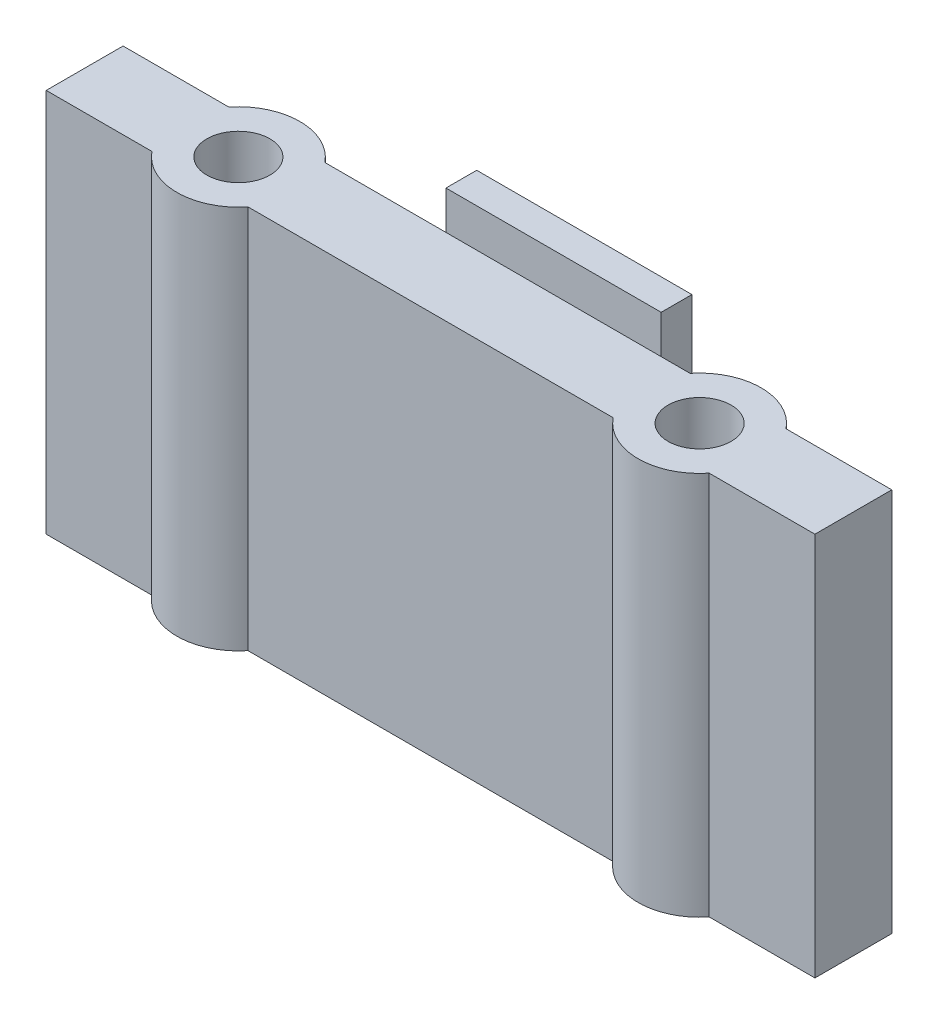
ISO-10303-21;
HEADER;
FILE_DESCRIPTION(('STEP AP214'),'2;1');
FILE_NAME('part.step','',(''),(''),'','','');
FILE_SCHEMA(('AUTOMOTIVE_DESIGN { 1 0 10303 214 1 1 1 1 }'));
ENDSEC;
DATA;
#1=APPLICATION_CONTEXT('core data for automotive mechanical design processes');
#2=APPLICATION_PROTOCOL_DEFINITION('international standard','automotive_design',2000,#1);
#3=PRODUCT_CONTEXT('',#1,'mechanical');
#4=PRODUCT('Part','Part','',(#3));
#5=PRODUCT_RELATED_PRODUCT_CATEGORY('part','',(#4));
#6=PRODUCT_DEFINITION_FORMATION('','',#4);
#7=PRODUCT_DEFINITION_CONTEXT('part definition',#1,'design');
#8=PRODUCT_DEFINITION('design','',#6,#7);
#9=PRODUCT_DEFINITION_SHAPE('','',#8);
#10=(LENGTH_UNIT() NAMED_UNIT(*) SI_UNIT(.MILLI.,.METRE.));
#11=(NAMED_UNIT(*) PLANE_ANGLE_UNIT() SI_UNIT($,.RADIAN.));
#12=(NAMED_UNIT(*) SI_UNIT($,.STERADIAN.) SOLID_ANGLE_UNIT());
#13=UNCERTAINTY_MEASURE_WITH_UNIT(LENGTH_MEASURE(1.E-05),#10,'distance_accuracy_value','');
#14=(GEOMETRIC_REPRESENTATION_CONTEXT(3) GLOBAL_UNCERTAINTY_ASSIGNED_CONTEXT((#13)) GLOBAL_UNIT_ASSIGNED_CONTEXT((#10,
#11,#12)) REPRESENTATION_CONTEXT('',''));
#15=CARTESIAN_POINT('',(0.,0.,0.));
#16=DIRECTION('',(0.,0.,1.));
#17=DIRECTION('',(1.,0.,0.));
#18=AXIS2_PLACEMENT_3D('',#15,#16,#17);
#19=CARTESIAN_POINT('',(7.,20.5,-7.5));
#20=DIRECTION('',(0.,-1.,0.));
#21=DIRECTION('',(0.,0.,-1.));
#22=AXIS2_PLACEMENT_3D('',#19,#20,#21);
#23=PLANE('',#22);
#24=DIRECTION('',(1.,0.,0.));
#25=VECTOR('',#24,1.);
#26=CARTESIAN_POINT('',(7.,20.5,-5.5));
#27=LINE('',#26,#25);
#28=CARTESIAN_POINT('',(-7.00000000000001,20.5,-5.5));
#29=VERTEX_POINT('',#28);
#30=CARTESIAN_POINT('',(7.,20.5,-5.5));
#31=VERTEX_POINT('',#30);
#32=EDGE_CURVE('E358',#29,#31,#27,.T.);
#33=ORIENTED_EDGE('',*,*,#32,.F.);
#34=DIRECTION('',(0.,0.,1.));
#35=VECTOR('',#34,1.);
#36=CARTESIAN_POINT('',(-7.00000000000001,20.5,-7.5));
#37=LINE('',#36,#35);
#38=CARTESIAN_POINT('',(-7.00000000000001,20.5,-2.5));
#39=VERTEX_POINT('',#38);
#40=EDGE_CURVE('E55',#29,#39,#37,.T.);
#41=ORIENTED_EDGE('',*,*,#40,.T.);
#42=DIRECTION('',(1.,0.,0.));
#43=VECTOR('',#42,1.);
#44=CARTESIAN_POINT('',(7.,20.5,-2.5));
#45=LINE('',#44,#43);
#46=CARTESIAN_POINT('',(7.,20.5,-2.5));
#47=VERTEX_POINT('',#46);
#48=EDGE_CURVE('E327',#39,#47,#45,.T.);
#49=ORIENTED_EDGE('',*,*,#48,.T.);
#50=DIRECTION('',(0.,0.,1.));
#51=VECTOR('',#50,1.);
#52=CARTESIAN_POINT('',(7.,20.5,-7.5));
#53=LINE('',#52,#51);
#54=EDGE_CURVE('E322',#31,#47,#53,.T.);
#55=ORIENTED_EDGE('',*,*,#54,.F.);
#56=EDGE_LOOP('',(#33,#41,#49,#55));
#57=FACE_BOUND('',#56,.T.);
#58=ADVANCED_FACE('F39',(#57),#23,.F.);
#59=CARTESIAN_POINT('',(-11.8775010008008,25.,-2.5));
#60=DIRECTION('',(0.,0.,1.));
#61=DIRECTION('',(1.,0.,0.));
#62=AXIS2_PLACEMENT_3D('',#59,#60,#61);
#63=PLANE('',#62);
#64=ORIENTED_EDGE('',*,*,#48,.F.);
#65=DIRECTION('',(0.,1.,0.));
#66=VECTOR('',#65,1.);
#67=CARTESIAN_POINT('',(-7.00000000000001,20.5,-2.5));
#68=LINE('',#67,#66);
#69=CARTESIAN_POINT('',(-7.00000000000001,13.5,-2.5));
#70=VERTEX_POINT('',#69);
#71=EDGE_CURVE('E331',#70,#39,#68,.T.);
#72=ORIENTED_EDGE('',*,*,#71,.F.);
#73=DIRECTION('',(1.,0.,0.));
#74=VECTOR('',#73,1.);
#75=CARTESIAN_POINT('',(-11.8775010008008,13.5,-2.5));
#76=LINE('',#75,#74);
#77=CARTESIAN_POINT('',(6.99999999999999,13.5,-2.5));
#78=VERTEX_POINT('',#77);
#79=EDGE_CURVE('E363',#70,#78,#76,.T.);
#80=ORIENTED_EDGE('',*,*,#79,.T.);
#81=DIRECTION('',(0.,-1.,0.));
#82=VECTOR('',#81,1.);
#83=CARTESIAN_POINT('',(7.,20.5,-2.5));
#84=LINE('',#83,#82);
#85=EDGE_CURVE('E335',#47,#78,#84,.T.);
#86=ORIENTED_EDGE('',*,*,#85,.F.);
#87=EDGE_LOOP('',(#64,#72,#80,#86));
#88=FACE_BOUND('',#87,.T.);
#89=DIRECTION('',(0.,-1.,0.));
#90=VECTOR('',#89,1.);
#91=CARTESIAN_POINT('',(-11.8775010008008,25.,-2.5));
#92=LINE('',#91,#90);
#93=CARTESIAN_POINT('',(-11.8775010008008,25.,-2.5));
#94=VERTEX_POINT('',#93);
#95=CARTESIAN_POINT('',(-11.8775010008008,0.,-2.5));
#96=VERTEX_POINT('',#95);
#97=EDGE_CURVE('E233',#94,#96,#92,.T.);
#98=ORIENTED_EDGE('',*,*,#97,.F.);
#99=DIRECTION('',(-1.,0.,0.));
#100=VECTOR('',#99,1.);
#101=CARTESIAN_POINT('',(-11.8775010008008,25.,-2.5));
#102=LINE('',#101,#100);
#103=CARTESIAN_POINT('',(11.8775010008008,25.,-2.5));
#104=VERTEX_POINT('',#103);
#105=EDGE_CURVE('E267',#104,#94,#102,.T.);
#106=ORIENTED_EDGE('',*,*,#105,.F.);
#107=DIRECTION('',(0.,-1.,0.));
#108=VECTOR('',#107,1.);
#109=CARTESIAN_POINT('',(11.8775010008008,25.,-2.5));
#110=LINE('',#109,#108);
#111=CARTESIAN_POINT('',(11.8775010008008,0.,-2.5));
#112=VERTEX_POINT('',#111);
#113=EDGE_CURVE('E237',#104,#112,#110,.T.);
#114=ORIENTED_EDGE('',*,*,#113,.T.);
#115=DIRECTION('',(-1.,0.,0.));
#116=VECTOR('',#115,1.);
#117=CARTESIAN_POINT('',(-11.8775010008008,0.,-2.5));
#118=LINE('',#117,#116);
#119=EDGE_CURVE('E192',#112,#96,#118,.T.);
#120=ORIENTED_EDGE('',*,*,#119,.T.);
#121=EDGE_LOOP('',(#98,#106,#114,#120));
#122=FACE_BOUND('',#121,.T.);
#123=ADVANCED_FACE('F266',(#88,#122),#63,.F.);
#124=CARTESIAN_POINT('',(15.,25.,0.));
#125=DIRECTION('',(0.,1.,0.));
#126=DIRECTION('',(0.,0.,1.));
#127=AXIS2_PLACEMENT_3D('',#124,#125,#126);
#128=PLANE('',#127);
#129=DIRECTION('',(1.,0.,0.));
#130=VECTOR('',#129,1.);
#131=CARTESIAN_POINT('',(-11.8775010008008,25.,2.5));
#132=LINE('',#131,#130);
#133=CARTESIAN_POINT('',(-11.8775010008008,25.,2.5));
#134=VERTEX_POINT('',#133);
#135=CARTESIAN_POINT('',(11.8775010008008,25.,2.5));
#136=VERTEX_POINT('',#135);
#137=EDGE_CURVE('E150',#134,#136,#132,.T.);
#138=ORIENTED_EDGE('',*,*,#137,.T.);
#139=CARTESIAN_POINT('',(15.,25.,0.));
#140=DIRECTION('',(0.,1.,0.));
#141=DIRECTION('',(0.,0.,1.));
#142=AXIS2_PLACEMENT_3D('',#139,#140,#141);
#143=CIRCLE('',#142,4.);
#144=CARTESIAN_POINT('',(18.1224989991992,25.,2.5));
#145=VERTEX_POINT('',#144);
#146=EDGE_CURVE('E64',#136,#145,#143,.T.);
#147=ORIENTED_EDGE('',*,*,#146,.T.);
#148=DIRECTION('',(1.,0.,0.));
#149=VECTOR('',#148,1.);
#150=CARTESIAN_POINT('',(18.1224989991992,25.,2.5));
#151=LINE('',#150,#149);
#152=CARTESIAN_POINT('',(25.,25.,2.5));
#153=VERTEX_POINT('',#152);
#154=EDGE_CURVE('E214',#145,#153,#151,.T.);
#155=ORIENTED_EDGE('',*,*,#154,.T.);
#156=DIRECTION('',(0.,0.,-1.));
#157=VECTOR('',#156,1.);
#158=CARTESIAN_POINT('',(25.,25.,-2.5));
#159=LINE('',#158,#157);
#160=CARTESIAN_POINT('',(25.,25.,-2.5));
#161=VERTEX_POINT('',#160);
#162=EDGE_CURVE('E117',#153,#161,#159,.T.);
#163=ORIENTED_EDGE('',*,*,#162,.T.);
#164=DIRECTION('',(-1.,0.,0.));
#165=VECTOR('',#164,1.);
#166=CARTESIAN_POINT('',(18.1224989991992,25.,-2.5));
#167=LINE('',#166,#165);
#168=CARTESIAN_POINT('',(18.1224989991992,25.,-2.5));
#169=VERTEX_POINT('',#168);
#170=EDGE_CURVE('E251',#161,#169,#167,.T.);
#171=ORIENTED_EDGE('',*,*,#170,.T.);
#172=CARTESIAN_POINT('',(15.,25.,0.));
#173=DIRECTION('',(0.,1.,0.));
#174=DIRECTION('',(0.,0.,1.));
#175=AXIS2_PLACEMENT_3D('',#172,#173,#174);
#176=CIRCLE('',#175,4.);
#177=EDGE_CURVE('E271',#169,#104,#176,.T.);
#178=ORIENTED_EDGE('',*,*,#177,.T.);
#179=ORIENTED_EDGE('',*,*,#105,.T.);
#180=CARTESIAN_POINT('',(-15.,25.,0.));
#181=DIRECTION('',(0.,1.,0.));
#182=DIRECTION('',(0.,0.,1.));
#183=AXIS2_PLACEMENT_3D('',#180,#181,#182);
#184=CIRCLE('',#183,4.);
#185=CARTESIAN_POINT('',(-18.1224989991992,25.,-2.5));
#186=VERTEX_POINT('',#185);
#187=EDGE_CURVE('E270',#94,#186,#184,.T.);
#188=ORIENTED_EDGE('',*,*,#187,.T.);
#189=DIRECTION('',(-1.,0.,0.));
#190=VECTOR('',#189,1.);
#191=CARTESIAN_POINT('',(-25.,25.,-2.5));
#192=LINE('',#191,#190);
#193=CARTESIAN_POINT('',(-25.,25.,-2.5));
#194=VERTEX_POINT('',#193);
#195=EDGE_CURVE('E275',#186,#194,#192,.T.);
#196=ORIENTED_EDGE('',*,*,#195,.T.);
#197=DIRECTION('',(0.,0.,1.));
#198=VECTOR('',#197,1.);
#199=CARTESIAN_POINT('',(-25.,25.,-2.5));
#200=LINE('',#199,#198);
#201=CARTESIAN_POINT('',(-25.,25.,2.5));
#202=VERTEX_POINT('',#201);
#203=EDGE_CURVE('E282',#194,#202,#200,.T.);
#204=ORIENTED_EDGE('',*,*,#203,.T.);
#205=DIRECTION('',(1.,0.,0.));
#206=VECTOR('',#205,1.);
#207=CARTESIAN_POINT('',(-25.,25.,2.5));
#208=LINE('',#207,#206);
#209=CARTESIAN_POINT('',(-18.1224989991992,25.,2.5));
#210=VERTEX_POINT('',#209);
#211=EDGE_CURVE('E153',#202,#210,#208,.T.);
#212=ORIENTED_EDGE('',*,*,#211,.T.);
#213=CARTESIAN_POINT('',(-15.,25.,0.));
#214=DIRECTION('',(0.,1.,0.));
#215=DIRECTION('',(0.,0.,1.));
#216=AXIS2_PLACEMENT_3D('',#213,#214,#215);
#217=CIRCLE('',#216,4.);
#218=EDGE_CURVE('E145',#210,#134,#217,.T.);
#219=ORIENTED_EDGE('',*,*,#218,.T.);
#220=EDGE_LOOP('',(#138,#147,#155,#163,#171,#178,#179,#188,#196,#204,#212,#219));
#221=FACE_BOUND('',#220,.T.);
#222=CARTESIAN_POINT('',(-15.,25.,0.));
#223=DIRECTION('',(0.,1.,0.));
#224=DIRECTION('',(0.,0.,1.));
#225=AXIS2_PLACEMENT_3D('',#222,#223,#224);
#226=CIRCLE('',#225,2.05);
#227=CARTESIAN_POINT('',(-15.,25.,2.05));
#228=VERTEX_POINT('',#227);
#229=EDGE_CURVE('E183',#228,#228,#226,.T.);
#230=ORIENTED_EDGE('',*,*,#229,.F.);
#231=EDGE_LOOP('',(#230));
#232=FACE_BOUND('',#231,.T.);
#233=CARTESIAN_POINT('',(15.,25.,0.));
#234=DIRECTION('',(0.,1.,0.));
#235=DIRECTION('',(0.,0.,1.));
#236=AXIS2_PLACEMENT_3D('',#233,#234,#235);
#237=CIRCLE('',#236,2.05);
#238=CARTESIAN_POINT('',(15.,25.,2.05));
#239=VERTEX_POINT('',#238);
#240=EDGE_CURVE('E309',#239,#239,#237,.T.);
#241=ORIENTED_EDGE('',*,*,#240,.F.);
#242=EDGE_LOOP('',(#241));
#243=FACE_BOUND('',#242,.T.);
#244=ADVANCED_FACE('F147',(#221,#232,#243),#128,.T.);
#245=CARTESIAN_POINT('',(15.,0.,0.));
#246=DIRECTION('',(0.,1.,0.));
#247=DIRECTION('',(0.,0.,1.));
#248=AXIS2_PLACEMENT_3D('',#245,#246,#247);
#249=PLANE('',#248);
#250=DIRECTION('',(1.,0.,0.));
#251=VECTOR('',#250,1.);
#252=CARTESIAN_POINT('',(18.1224989991992,0.,2.5));
#253=LINE('',#252,#251);
#254=CARTESIAN_POINT('',(18.1224989991992,0.,2.5));
#255=VERTEX_POINT('',#254);
#256=CARTESIAN_POINT('',(25.,0.,2.5));
#257=VERTEX_POINT('',#256);
#258=EDGE_CURVE('E178',#255,#257,#253,.T.);
#259=ORIENTED_EDGE('',*,*,#258,.F.);
#260=CARTESIAN_POINT('',(15.,0.,0.));
#261=DIRECTION('',(0.,1.,0.));
#262=DIRECTION('',(0.,0.,1.));
#263=AXIS2_PLACEMENT_3D('',#260,#261,#262);
#264=CIRCLE('',#263,4.);
#265=CARTESIAN_POINT('',(11.8775010008008,0.,2.5));
#266=VERTEX_POINT('',#265);
#267=EDGE_CURVE('E109',#266,#255,#264,.T.);
#268=ORIENTED_EDGE('',*,*,#267,.F.);
#269=DIRECTION('',(1.,0.,0.));
#270=VECTOR('',#269,1.);
#271=CARTESIAN_POINT('',(-11.8775010008008,0.,2.5));
#272=LINE('',#271,#270);
#273=CARTESIAN_POINT('',(-11.8775010008008,0.,2.5));
#274=VERTEX_POINT('',#273);
#275=EDGE_CURVE('E209',#274,#266,#272,.T.);
#276=ORIENTED_EDGE('',*,*,#275,.F.);
#277=CARTESIAN_POINT('',(-15.,0.,0.));
#278=DIRECTION('',(0.,1.,0.));
#279=DIRECTION('',(0.,0.,1.));
#280=AXIS2_PLACEMENT_3D('',#277,#278,#279);
#281=CIRCLE('',#280,4.);
#282=CARTESIAN_POINT('',(-18.1224989991992,0.,2.5));
#283=VERTEX_POINT('',#282);
#284=EDGE_CURVE('E163',#283,#274,#281,.T.);
#285=ORIENTED_EDGE('',*,*,#284,.F.);
#286=DIRECTION('',(1.,0.,0.));
#287=VECTOR('',#286,1.);
#288=CARTESIAN_POINT('',(-25.,0.,2.5));
#289=LINE('',#288,#287);
#290=CARTESIAN_POINT('',(-25.,0.,2.5));
#291=VERTEX_POINT('',#290);
#292=EDGE_CURVE('E204',#291,#283,#289,.T.);
#293=ORIENTED_EDGE('',*,*,#292,.F.);
#294=DIRECTION('',(0.,0.,1.));
#295=VECTOR('',#294,1.);
#296=CARTESIAN_POINT('',(-25.,0.,-2.5));
#297=LINE('',#296,#295);
#298=CARTESIAN_POINT('',(-25.,0.,-2.5));
#299=VERTEX_POINT('',#298);
#300=EDGE_CURVE('E201',#299,#291,#297,.T.);
#301=ORIENTED_EDGE('',*,*,#300,.F.);
#302=DIRECTION('',(-1.,0.,0.));
#303=VECTOR('',#302,1.);
#304=CARTESIAN_POINT('',(-25.,0.,-2.5));
#305=LINE('',#304,#303);
#306=CARTESIAN_POINT('',(-18.1224989991992,0.,-2.5));
#307=VERTEX_POINT('',#306);
#308=EDGE_CURVE('E198',#307,#299,#305,.T.);
#309=ORIENTED_EDGE('',*,*,#308,.F.);
#310=CARTESIAN_POINT('',(-15.,0.,0.));
#311=DIRECTION('',(0.,1.,0.));
#312=DIRECTION('',(0.,0.,1.));
#313=AXIS2_PLACEMENT_3D('',#310,#311,#312);
#314=CIRCLE('',#313,4.);
#315=EDGE_CURVE('E195',#96,#307,#314,.T.);
#316=ORIENTED_EDGE('',*,*,#315,.F.);
#317=ORIENTED_EDGE('',*,*,#119,.F.);
#318=CARTESIAN_POINT('',(15.,0.,0.));
#319=DIRECTION('',(0.,1.,0.));
#320=DIRECTION('',(0.,0.,1.));
#321=AXIS2_PLACEMENT_3D('',#318,#319,#320);
#322=CIRCLE('',#321,4.);
#323=CARTESIAN_POINT('',(18.1224989991992,0.,-2.5));
#324=VERTEX_POINT('',#323);
#325=EDGE_CURVE('E189',#324,#112,#322,.T.);
#326=ORIENTED_EDGE('',*,*,#325,.F.);
#327=DIRECTION('',(-1.,0.,0.));
#328=VECTOR('',#327,1.);
#329=CARTESIAN_POINT('',(18.1224989991992,0.,-2.5));
#330=LINE('',#329,#328);
#331=CARTESIAN_POINT('',(25.,0.,-2.5));
#332=VERTEX_POINT('',#331);
#333=EDGE_CURVE('E186',#332,#324,#330,.T.);
#334=ORIENTED_EDGE('',*,*,#333,.F.);
#335=DIRECTION('',(0.,0.,-1.));
#336=VECTOR('',#335,1.);
#337=CARTESIAN_POINT('',(25.,0.,-2.5));
#338=LINE('',#337,#336);
#339=EDGE_CURVE('E182',#257,#332,#338,.T.);
#340=ORIENTED_EDGE('',*,*,#339,.F.);
#341=EDGE_LOOP('',(#259,#268,#276,#285,#293,#301,#309,#316,#317,#326,#334,#340));
#342=FACE_BOUND('',#341,.T.);
#343=CARTESIAN_POINT('',(-15.,0.,0.));
#344=DIRECTION('',(0.,1.,0.));
#345=DIRECTION('',(0.,0.,1.));
#346=AXIS2_PLACEMENT_3D('',#343,#344,#345);
#347=CIRCLE('',#346,2.05);
#348=CARTESIAN_POINT('',(-15.,0.,2.05));
#349=VERTEX_POINT('',#348);
#350=EDGE_CURVE('E304',#349,#349,#347,.T.);
#351=ORIENTED_EDGE('',*,*,#350,.T.);
#352=EDGE_LOOP('',(#351));
#353=FACE_BOUND('',#352,.T.);
#354=CARTESIAN_POINT('',(15.,0.,0.));
#355=DIRECTION('',(0.,1.,0.));
#356=DIRECTION('',(0.,0.,1.));
#357=AXIS2_PLACEMENT_3D('',#354,#355,#356);
#358=CIRCLE('',#357,2.05);
#359=CARTESIAN_POINT('',(15.,0.,2.05));
#360=VERTEX_POINT('',#359);
#361=EDGE_CURVE('E313',#360,#360,#358,.T.);
#362=ORIENTED_EDGE('',*,*,#361,.T.);
#363=EDGE_LOOP('',(#362));
#364=FACE_BOUND('',#363,.T.);
#365=ADVANCED_FACE('F255',(#342,#353,#364),#249,.F.);
#366=CARTESIAN_POINT('',(18.1224989991992,25.,2.5));
#367=DIRECTION('',(0.,0.,-1.));
#368=DIRECTION('',(-1.,0.,0.));
#369=AXIS2_PLACEMENT_3D('',#366,#367,#368);
#370=PLANE('',#369);
#371=ORIENTED_EDGE('',*,*,#258,.T.);
#372=DIRECTION('',(0.,-1.,0.));
#373=VECTOR('',#372,1.);
#374=CARTESIAN_POINT('',(25.,25.,2.5));
#375=LINE('',#374,#373);
#376=EDGE_CURVE('E11',#153,#257,#375,.T.);
#377=ORIENTED_EDGE('',*,*,#376,.F.);
#378=ORIENTED_EDGE('',*,*,#154,.F.);
#379=DIRECTION('',(0.,-1.,0.));
#380=VECTOR('',#379,1.);
#381=CARTESIAN_POINT('',(18.1224989991992,25.,2.5));
#382=LINE('',#381,#380);
#383=EDGE_CURVE('E174',#145,#255,#382,.T.);
#384=ORIENTED_EDGE('',*,*,#383,.T.);
#385=EDGE_LOOP('',(#371,#377,#378,#384));
#386=FACE_BOUND('',#385,.T.);
#387=ADVANCED_FACE('F41',(#386),#370,.F.);
#388=CARTESIAN_POINT('',(25.,25.,-2.5));
#389=DIRECTION('',(-1.,0.,0.));
#390=DIRECTION('',(0.,0.,1.));
#391=AXIS2_PLACEMENT_3D('',#388,#389,#390);
#392=PLANE('',#391);
#393=ORIENTED_EDGE('',*,*,#339,.T.);
#394=DIRECTION('',(0.,-1.,0.));
#395=VECTOR('',#394,1.);
#396=CARTESIAN_POINT('',(25.,25.,-2.5));
#397=LINE('',#396,#395);
#398=EDGE_CURVE('E48',#161,#332,#397,.T.);
#399=ORIENTED_EDGE('',*,*,#398,.F.);
#400=ORIENTED_EDGE('',*,*,#162,.F.);
#401=ORIENTED_EDGE('',*,*,#376,.T.);
#402=EDGE_LOOP('',(#393,#399,#400,#401));
#403=FACE_BOUND('',#402,.T.);
#404=ADVANCED_FACE('F448',(#403),#392,.F.);
#405=CARTESIAN_POINT('',(18.1224989991992,25.,-2.5));
#406=DIRECTION('',(0.,0.,1.));
#407=DIRECTION('',(1.,0.,0.));
#408=AXIS2_PLACEMENT_3D('',#405,#406,#407);
#409=PLANE('',#408);
#410=ORIENTED_EDGE('',*,*,#333,.T.);
#411=DIRECTION('',(0.,-1.,0.));
#412=VECTOR('',#411,1.);
#413=CARTESIAN_POINT('',(18.1224989991992,25.,-2.5));
#414=LINE('',#413,#412);
#415=EDGE_CURVE('E241',#169,#324,#414,.T.);
#416=ORIENTED_EDGE('',*,*,#415,.F.);
#417=ORIENTED_EDGE('',*,*,#170,.F.);
#418=ORIENTED_EDGE('',*,*,#398,.T.);
#419=EDGE_LOOP('',(#410,#416,#417,#418));
#420=FACE_BOUND('',#419,.T.);
#421=ADVANCED_FACE('F249',(#420),#409,.F.);
#422=CARTESIAN_POINT('',(15.,25.,0.));
#423=DIRECTION('',(0.,-1.,0.));
#424=DIRECTION('',(0.,0.,-1.));
#425=AXIS2_PLACEMENT_3D('',#422,#423,#424);
#426=CYLINDRICAL_SURFACE('',#425,4.);
#427=ORIENTED_EDGE('',*,*,#325,.T.);
#428=ORIENTED_EDGE('',*,*,#113,.F.);
#429=ORIENTED_EDGE('',*,*,#177,.F.);
#430=ORIENTED_EDGE('',*,*,#415,.T.);
#431=EDGE_LOOP('',(#427,#428,#429,#430));
#432=FACE_BOUND('',#431,.T.);
#433=ADVANCED_FACE('F261',(#432),#426,.T.);
#434=CARTESIAN_POINT('',(-15.,25.,0.));
#435=DIRECTION('',(0.,-1.,0.));
#436=DIRECTION('',(0.,0.,-1.));
#437=AXIS2_PLACEMENT_3D('',#434,#435,#436);
#438=CYLINDRICAL_SURFACE('',#437,4.);
#439=ORIENTED_EDGE('',*,*,#315,.T.);
#440=DIRECTION('',(0.,-1.,0.));
#441=VECTOR('',#440,1.);
#442=CARTESIAN_POINT('',(-18.1224989991992,25.,-2.5));
#443=LINE('',#442,#441);
#444=EDGE_CURVE('E229',#186,#307,#443,.T.);
#445=ORIENTED_EDGE('',*,*,#444,.F.);
#446=ORIENTED_EDGE('',*,*,#187,.F.);
#447=ORIENTED_EDGE('',*,*,#97,.T.);
#448=EDGE_LOOP('',(#439,#445,#446,#447));
#449=FACE_BOUND('',#448,.T.);
#450=ADVANCED_FACE('F443',(#449),#438,.T.);
#451=CARTESIAN_POINT('',(-25.,25.,-2.5));
#452=DIRECTION('',(0.,0.,1.));
#453=DIRECTION('',(1.,0.,0.));
#454=AXIS2_PLACEMENT_3D('',#451,#452,#453);
#455=PLANE('',#454);
#456=ORIENTED_EDGE('',*,*,#308,.T.);
#457=DIRECTION('',(0.,-1.,0.));
#458=VECTOR('',#457,1.);
#459=CARTESIAN_POINT('',(-25.,25.,-2.5));
#460=LINE('',#459,#458);
#461=EDGE_CURVE('E225',#194,#299,#460,.T.);
#462=ORIENTED_EDGE('',*,*,#461,.F.);
#463=ORIENTED_EDGE('',*,*,#195,.F.);
#464=ORIENTED_EDGE('',*,*,#444,.T.);
#465=EDGE_LOOP('',(#456,#462,#463,#464));
#466=FACE_BOUND('',#465,.T.);
#467=ADVANCED_FACE('F472',(#466),#455,.F.);
#468=CARTESIAN_POINT('',(-25.,25.,-2.5));
#469=DIRECTION('',(1.,0.,0.));
#470=DIRECTION('',(0.,0.,-1.));
#471=AXIS2_PLACEMENT_3D('',#468,#469,#470);
#472=PLANE('',#471);
#473=ORIENTED_EDGE('',*,*,#300,.T.);
#474=DIRECTION('',(0.,-1.,0.));
#475=VECTOR('',#474,1.);
#476=CARTESIAN_POINT('',(-25.,25.,2.5));
#477=LINE('',#476,#475);
#478=EDGE_CURVE('E221',#202,#291,#477,.T.);
#479=ORIENTED_EDGE('',*,*,#478,.F.);
#480=ORIENTED_EDGE('',*,*,#203,.F.);
#481=ORIENTED_EDGE('',*,*,#461,.T.);
#482=EDGE_LOOP('',(#473,#479,#480,#481));
#483=FACE_BOUND('',#482,.T.);
#484=ADVANCED_FACE('F290',(#483),#472,.F.);
#485=CARTESIAN_POINT('',(-25.,25.,2.5));
#486=DIRECTION('',(0.,0.,-1.));
#487=DIRECTION('',(-1.,0.,0.));
#488=AXIS2_PLACEMENT_3D('',#485,#486,#487);
#489=PLANE('',#488);
#490=ORIENTED_EDGE('',*,*,#292,.T.);
#491=DIRECTION('',(0.,-1.,0.));
#492=VECTOR('',#491,1.);
#493=CARTESIAN_POINT('',(-18.1224989991992,25.,2.5));
#494=LINE('',#493,#492);
#495=EDGE_CURVE('E167',#210,#283,#494,.T.);
#496=ORIENTED_EDGE('',*,*,#495,.F.);
#497=ORIENTED_EDGE('',*,*,#211,.F.);
#498=ORIENTED_EDGE('',*,*,#478,.T.);
#499=EDGE_LOOP('',(#490,#496,#497,#498));
#500=FACE_BOUND('',#499,.T.);
#501=ADVANCED_FACE('F294',(#500),#489,.F.);
#502=CARTESIAN_POINT('',(-15.,25.,0.));
#503=DIRECTION('',(0.,-1.,0.));
#504=DIRECTION('',(0.,0.,-1.));
#505=AXIS2_PLACEMENT_3D('',#502,#503,#504);
#506=CYLINDRICAL_SURFACE('',#505,4.);
#507=ORIENTED_EDGE('',*,*,#284,.T.);
#508=DIRECTION('',(0.,-1.,0.));
#509=VECTOR('',#508,1.);
#510=CARTESIAN_POINT('',(-11.8775010008008,25.,2.5));
#511=LINE('',#510,#509);
#512=EDGE_CURVE('E160',#134,#274,#511,.T.);
#513=ORIENTED_EDGE('',*,*,#512,.F.);
#514=ORIENTED_EDGE('',*,*,#218,.F.);
#515=ORIENTED_EDGE('',*,*,#495,.T.);
#516=EDGE_LOOP('',(#507,#513,#514,#515));
#517=FACE_BOUND('',#516,.T.);
#518=ADVANCED_FACE('F161',(#517),#506,.T.);
#519=CARTESIAN_POINT('',(-11.8775010008008,25.,2.5));
#520=DIRECTION('',(0.,0.,-1.));
#521=DIRECTION('',(-1.,0.,0.));
#522=AXIS2_PLACEMENT_3D('',#519,#520,#521);
#523=PLANE('',#522);
#524=DIRECTION('',(0.,-1.,0.));
#525=VECTOR('',#524,1.);
#526=CARTESIAN_POINT('',(11.8775010008008,25.,2.5));
#527=LINE('',#526,#525);
#528=EDGE_CURVE('E168',#136,#266,#527,.T.);
#529=ORIENTED_EDGE('',*,*,#528,.F.);
#530=ORIENTED_EDGE('',*,*,#137,.F.);
#531=ORIENTED_EDGE('',*,*,#512,.T.);
#532=ORIENTED_EDGE('',*,*,#275,.T.);
#533=EDGE_LOOP('',(#529,#530,#531,#532));
#534=FACE_BOUND('',#533,.T.);
#535=ADVANCED_FACE('F170',(#534),#523,.F.);
#536=CARTESIAN_POINT('',(15.,25.,0.));
#537=DIRECTION('',(0.,-1.,0.));
#538=DIRECTION('',(0.,0.,-1.));
#539=AXIS2_PLACEMENT_3D('',#536,#537,#538);
#540=CYLINDRICAL_SURFACE('',#539,4.);
#541=ORIENTED_EDGE('',*,*,#267,.T.);
#542=ORIENTED_EDGE('',*,*,#383,.F.);
#543=ORIENTED_EDGE('',*,*,#146,.F.);
#544=ORIENTED_EDGE('',*,*,#528,.T.);
#545=EDGE_LOOP('',(#541,#542,#543,#544));
#546=FACE_BOUND('',#545,.T.);
#547=ADVANCED_FACE('F295',(#546),#540,.T.);
#548=CARTESIAN_POINT('',(-15.,25.,0.));
#549=DIRECTION('',(0.,-1.,0.));
#550=DIRECTION('',(0.,0.,-1.));
#551=AXIS2_PLACEMENT_3D('',#548,#549,#550);
#552=CYLINDRICAL_SURFACE('',#551,2.05);
#553=ORIENTED_EDGE('',*,*,#229,.T.);
#554=EDGE_LOOP('',(#553));
#555=FACE_BOUND('',#554,.T.);
#556=ORIENTED_EDGE('',*,*,#350,.F.);
#557=EDGE_LOOP('',(#556));
#558=FACE_BOUND('',#557,.T.);
#559=ADVANCED_FACE('F464',(#555,#558),#552,.F.);
#560=CARTESIAN_POINT('',(15.,25.,0.));
#561=DIRECTION('',(0.,-1.,0.));
#562=DIRECTION('',(0.,0.,-1.));
#563=AXIS2_PLACEMENT_3D('',#560,#561,#562);
#564=CYLINDRICAL_SURFACE('',#563,2.05);
#565=ORIENTED_EDGE('',*,*,#240,.T.);
#566=EDGE_LOOP('',(#565));
#567=FACE_BOUND('',#566,.T.);
#568=ORIENTED_EDGE('',*,*,#361,.F.);
#569=EDGE_LOOP('',(#568));
#570=FACE_BOUND('',#569,.T.);
#571=ADVANCED_FACE('F521',(#567,#570),#564,.F.);
#572=CARTESIAN_POINT('',(7.,20.5,-7.5));
#573=DIRECTION('',(-1.,0.,0.));
#574=DIRECTION('',(0.,0.,1.));
#575=AXIS2_PLACEMENT_3D('',#572,#573,#574);
#576=PLANE('',#575);
#577=ORIENTED_EDGE('',*,*,#85,.T.);
#578=DIRECTION('',(0.,-0.707106781186546,0.707106781186549));
#579=VECTOR('',#578,1.);
#580=CARTESIAN_POINT('',(6.99999999999999,18.5,-7.5));
#581=LINE('',#580,#579);
#582=CARTESIAN_POINT('',(6.99999999999999,18.5,-7.5));
#583=VERTEX_POINT('',#582);
#584=EDGE_CURVE('E382',#583,#78,#581,.T.);
#585=ORIENTED_EDGE('',*,*,#584,.F.);
#586=DIRECTION('',(0.,-1.,0.));
#587=VECTOR('',#586,1.);
#588=CARTESIAN_POINT('',(7.,20.5,-7.5));
#589=LINE('',#588,#587);
#590=CARTESIAN_POINT('',(7.,24.5,-7.5));
#591=VERTEX_POINT('',#590);
#592=EDGE_CURVE('E330',#591,#583,#589,.T.);
#593=ORIENTED_EDGE('',*,*,#592,.F.);
#594=DIRECTION('',(0.,0.,-1.));
#595=VECTOR('',#594,1.);
#596=CARTESIAN_POINT('',(7.,24.5,-5.5));
#597=LINE('',#596,#595);
#598=CARTESIAN_POINT('',(7.,24.5,-5.5));
#599=VERTEX_POINT('',#598);
#600=EDGE_CURVE('E362',#599,#591,#597,.T.);
#601=ORIENTED_EDGE('',*,*,#600,.F.);
#602=DIRECTION('',(0.,-1.,0.));
#603=VECTOR('',#602,1.);
#604=CARTESIAN_POINT('',(7.,24.5,-5.5));
#605=LINE('',#604,#603);
#606=EDGE_CURVE('E353',#599,#31,#605,.T.);
#607=ORIENTED_EDGE('',*,*,#606,.T.);
#608=ORIENTED_EDGE('',*,*,#54,.T.);
#609=EDGE_LOOP('',(#577,#585,#593,#601,#607,#608));
#610=FACE_BOUND('',#609,.T.);
#611=ADVANCED_FACE('F413',(#610),#576,.F.);
#612=CARTESIAN_POINT('',(-7.00000000000001,20.5,-7.5));
#613=DIRECTION('',(1.,0.,0.));
#614=DIRECTION('',(0.,0.,-1.));
#615=AXIS2_PLACEMENT_3D('',#612,#613,#614);
#616=PLANE('',#615);
#617=DIRECTION('',(0.,-0.707106781186546,0.707106781186549));
#618=VECTOR('',#617,1.);
#619=CARTESIAN_POINT('',(-7.00000000000001,18.5,-7.5));
#620=LINE('',#619,#618);
#621=CARTESIAN_POINT('',(-7.00000000000001,18.5,-7.5));
#622=VERTEX_POINT('',#621);
#623=EDGE_CURVE('E381',#622,#70,#620,.T.);
#624=ORIENTED_EDGE('',*,*,#623,.T.);
#625=ORIENTED_EDGE('',*,*,#71,.T.);
#626=ORIENTED_EDGE('',*,*,#40,.F.);
#627=DIRECTION('',(0.,-1.,0.));
#628=VECTOR('',#627,1.);
#629=CARTESIAN_POINT('',(-7.00000000000001,24.5,-5.5));
#630=LINE('',#629,#628);
#631=CARTESIAN_POINT('',(-7.00000000000001,24.5,-5.5));
#632=VERTEX_POINT('',#631);
#633=EDGE_CURVE('E339',#632,#29,#630,.T.);
#634=ORIENTED_EDGE('',*,*,#633,.F.);
#635=DIRECTION('',(0.,0.,1.));
#636=VECTOR('',#635,1.);
#637=CARTESIAN_POINT('',(-7.00000000000001,24.5,-5.5));
#638=LINE('',#637,#636);
#639=CARTESIAN_POINT('',(-7.00000000000001,24.5,-7.5));
#640=VERTEX_POINT('',#639);
#641=EDGE_CURVE('E367',#640,#632,#638,.T.);
#642=ORIENTED_EDGE('',*,*,#641,.F.);
#643=DIRECTION('',(0.,1.,0.));
#644=VECTOR('',#643,1.);
#645=CARTESIAN_POINT('',(-7.00000000000001,20.5,-7.5));
#646=LINE('',#645,#644);
#647=EDGE_CURVE('E326',#622,#640,#646,.T.);
#648=ORIENTED_EDGE('',*,*,#647,.F.);
#649=EDGE_LOOP('',(#624,#625,#626,#634,#642,#648));
#650=FACE_BOUND('',#649,.T.);
#651=ADVANCED_FACE('F392',(#650),#616,.F.);
#652=CARTESIAN_POINT('',(0.,0.,-7.5));
#653=DIRECTION('',(0.,0.,-1.));
#654=DIRECTION('',(-1.,0.,0.));
#655=AXIS2_PLACEMENT_3D('',#652,#653,#654);
#656=PLANE('',#655);
#657=ORIENTED_EDGE('',*,*,#592,.T.);
#658=DIRECTION('',(-1.,0.,0.));
#659=VECTOR('',#658,1.);
#660=CARTESIAN_POINT('',(7.,18.5,-7.5));
#661=LINE('',#660,#659);
#662=EDGE_CURVE('E343',#583,#622,#661,.T.);
#663=ORIENTED_EDGE('',*,*,#662,.T.);
#664=ORIENTED_EDGE('',*,*,#647,.T.);
#665=DIRECTION('',(-1.,0.,0.));
#666=VECTOR('',#665,1.);
#667=CARTESIAN_POINT('',(7.,24.5,-7.5));
#668=LINE('',#667,#666);
#669=EDGE_CURVE('E371',#591,#640,#668,.T.);
#670=ORIENTED_EDGE('',*,*,#669,.F.);
#671=EDGE_LOOP('',(#657,#663,#664,#670));
#672=FACE_BOUND('',#671,.T.);
#673=ADVANCED_FACE('F405',(#672),#656,.T.);
#674=CARTESIAN_POINT('',(7.,24.5,-5.5));
#675=DIRECTION('',(0.,0.,-1.));
#676=DIRECTION('',(-1.,0.,0.));
#677=AXIS2_PLACEMENT_3D('',#674,#675,#676);
#678=PLANE('',#677);
#679=ORIENTED_EDGE('',*,*,#32,.T.);
#680=ORIENTED_EDGE('',*,*,#606,.F.);
#681=DIRECTION('',(1.,0.,0.));
#682=VECTOR('',#681,1.);
#683=CARTESIAN_POINT('',(7.,24.5,-5.5));
#684=LINE('',#683,#682);
#685=EDGE_CURVE('E357',#632,#599,#684,.T.);
#686=ORIENTED_EDGE('',*,*,#685,.F.);
#687=ORIENTED_EDGE('',*,*,#633,.T.);
#688=EDGE_LOOP('',(#679,#680,#686,#687));
#689=FACE_BOUND('',#688,.T.);
#690=ADVANCED_FACE('F427',(#689),#678,.F.);
#691=CARTESIAN_POINT('',(0.,24.5,0.));
#692=DIRECTION('',(0.,1.,0.));
#693=DIRECTION('',(0.,0.,1.));
#694=AXIS2_PLACEMENT_3D('',#691,#692,#693);
#695=PLANE('',#694);
#696=ORIENTED_EDGE('',*,*,#600,.T.);
#697=ORIENTED_EDGE('',*,*,#669,.T.);
#698=ORIENTED_EDGE('',*,*,#641,.T.);
#699=ORIENTED_EDGE('',*,*,#685,.T.);
#700=EDGE_LOOP('',(#696,#697,#698,#699));
#701=FACE_BOUND('',#700,.T.);
#702=ADVANCED_FACE('F551',(#701),#695,.T.);
#703=CARTESIAN_POINT('',(-7.00000000000001,18.5,-7.5));
#704=DIRECTION('',(0.,-0.707106781186549,-0.707106781186546));
#705=DIRECTION('',(0.,-0.707106781186546,0.707106781186549));
#706=AXIS2_PLACEMENT_3D('',#703,#704,#705);
#707=PLANE('',#706);
#708=ORIENTED_EDGE('',*,*,#79,.F.);
#709=ORIENTED_EDGE('',*,*,#623,.F.);
#710=ORIENTED_EDGE('',*,*,#662,.F.);
#711=ORIENTED_EDGE('',*,*,#584,.T.);
#712=EDGE_LOOP('',(#708,#709,#710,#711));
#713=FACE_BOUND('',#712,.T.);
#714=ADVANCED_FACE('F401',(#713),#707,.T.);
#715=CLOSED_SHELL('',(#58,#123,#244,#365,#387,#404,#421,#433,#450,#467,#484,#501,#518,#535,#547,
#559,#571,#611,#651,#673,#690,#702,#714));
#716=MANIFOLD_SOLID_BREP('B2',#715);
#717=ADVANCED_BREP_SHAPE_REPRESENTATION('',(#18,#716),#14);
#718=SHAPE_DEFINITION_REPRESENTATION(#9,#717);
ENDSEC;
END-ISO-10303-21;
